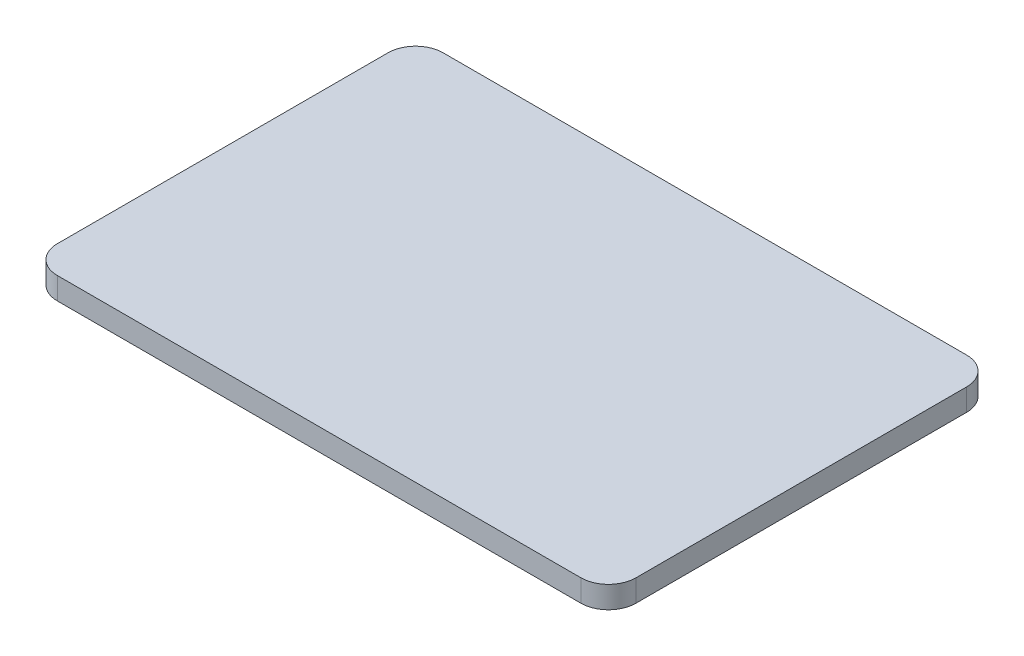
ISO-10303-21;
HEADER;
FILE_DESCRIPTION(('STEP AP214'),'2;1');
FILE_NAME('part.step','',(''),(''),'','','');
FILE_SCHEMA(('AUTOMOTIVE_DESIGN { 1 0 10303 214 1 1 1 1 }'));
ENDSEC;
DATA;
#1=APPLICATION_CONTEXT('core data for automotive mechanical design processes');
#2=APPLICATION_PROTOCOL_DEFINITION('international standard','automotive_design',2000,#1);
#3=PRODUCT_CONTEXT('',#1,'mechanical');
#4=PRODUCT('Part','Part','',(#3));
#5=PRODUCT_RELATED_PRODUCT_CATEGORY('part','',(#4));
#6=PRODUCT_DEFINITION_FORMATION('','',#4);
#7=PRODUCT_DEFINITION_CONTEXT('part definition',#1,'design');
#8=PRODUCT_DEFINITION('design','',#6,#7);
#9=PRODUCT_DEFINITION_SHAPE('','',#8);
#10=(LENGTH_UNIT() NAMED_UNIT(*) SI_UNIT(.MILLI.,.METRE.));
#11=(NAMED_UNIT(*) PLANE_ANGLE_UNIT() SI_UNIT($,.RADIAN.));
#12=(NAMED_UNIT(*) SI_UNIT($,.STERADIAN.) SOLID_ANGLE_UNIT());
#13=UNCERTAINTY_MEASURE_WITH_UNIT(LENGTH_MEASURE(1.E-05),#10,'distance_accuracy_value','');
#14=(GEOMETRIC_REPRESENTATION_CONTEXT(3) GLOBAL_UNCERTAINTY_ASSIGNED_CONTEXT((#13)) GLOBAL_UNIT_ASSIGNED_CONTEXT((#10,
#11,#12)) REPRESENTATION_CONTEXT('',''));
#15=CARTESIAN_POINT('',(0.,0.,0.));
#16=DIRECTION('',(0.,0.,1.));
#17=DIRECTION('',(1.,0.,0.));
#18=AXIS2_PLACEMENT_3D('',#15,#16,#17);
#19=CARTESIAN_POINT('',(0.,1.6,0.));
#20=DIRECTION('',(1.,0.,0.));
#21=DIRECTION('',(0.,0.,-1.));
#22=AXIS2_PLACEMENT_3D('',#19,#20,#21);
#23=PLANE('',#22);
#24=DIRECTION('',(0.,0.,1.));
#25=VECTOR('',#24,1.);
#26=CARTESIAN_POINT('',(0.,0.,0.));
#27=LINE('',#26,#25);
#28=CARTESIAN_POINT('',(0.,0.,-26.));
#29=VERTEX_POINT('',#28);
#30=CARTESIAN_POINT('',(0.,0.,-2.));
#31=VERTEX_POINT('',#30);
#32=EDGE_CURVE('E126',#29,#31,#27,.T.);
#33=ORIENTED_EDGE('',*,*,#32,.T.);
#34=DIRECTION('',(0.,-1.,0.));
#35=VECTOR('',#34,1.);
#36=CARTESIAN_POINT('',(0.,1.6,-2.));
#37=LINE('',#36,#35);
#38=CARTESIAN_POINT('',(0.,1.6,-2.));
#39=VERTEX_POINT('',#38);
#40=EDGE_CURVE('E104',#31,#39,#37,.F.);
#41=ORIENTED_EDGE('',*,*,#40,.T.);
#42=DIRECTION('',(0.,0.,1.));
#43=VECTOR('',#42,1.);
#44=CARTESIAN_POINT('',(0.,1.6,0.));
#45=LINE('',#44,#43);
#46=CARTESIAN_POINT('',(0.,1.6,-26.));
#47=VERTEX_POINT('',#46);
#48=EDGE_CURVE('E135',#47,#39,#45,.T.);
#49=ORIENTED_EDGE('',*,*,#48,.F.);
#50=DIRECTION('',(0.,-1.,0.));
#51=VECTOR('',#50,1.);
#52=CARTESIAN_POINT('',(0.,1.6,-26.));
#53=LINE('',#52,#51);
#54=EDGE_CURVE('E109',#47,#29,#53,.T.);
#55=ORIENTED_EDGE('',*,*,#54,.T.);
#56=EDGE_LOOP('',(#33,#41,#49,#55));
#57=FACE_BOUND('',#56,.T.);
#58=ADVANCED_FACE('F33',(#57),#23,.F.);
#59=CARTESIAN_POINT('',(0.,1.6,0.));
#60=DIRECTION('',(0.,0.,-1.));
#61=DIRECTION('',(-1.,0.,0.));
#62=AXIS2_PLACEMENT_3D('',#59,#60,#61);
#63=PLANE('',#62);
#64=DIRECTION('',(1.,0.,0.));
#65=VECTOR('',#64,1.);
#66=CARTESIAN_POINT('',(0.,1.6,0.));
#67=LINE('',#66,#65);
#68=CARTESIAN_POINT('',(2.,1.6,0.));
#69=VERTEX_POINT('',#68);
#70=CARTESIAN_POINT('',(40.,1.6,0.));
#71=VERTEX_POINT('',#70);
#72=EDGE_CURVE('E119',#69,#71,#67,.T.);
#73=ORIENTED_EDGE('',*,*,#72,.F.);
#74=DIRECTION('',(0.,-1.,0.));
#75=VECTOR('',#74,1.);
#76=CARTESIAN_POINT('',(2.,1.6,0.));
#77=LINE('',#76,#75);
#78=CARTESIAN_POINT('',(2.,0.,0.));
#79=VERTEX_POINT('',#78);
#80=EDGE_CURVE('E103',#69,#79,#77,.T.);
#81=ORIENTED_EDGE('',*,*,#80,.T.);
#82=DIRECTION('',(1.,0.,0.));
#83=VECTOR('',#82,1.);
#84=CARTESIAN_POINT('',(0.,0.,0.));
#85=LINE('',#84,#83);
#86=CARTESIAN_POINT('',(40.,0.,0.));
#87=VERTEX_POINT('',#86);
#88=EDGE_CURVE('E116',#79,#87,#85,.T.);
#89=ORIENTED_EDGE('',*,*,#88,.T.);
#90=DIRECTION('',(0.,-1.,0.));
#91=VECTOR('',#90,1.);
#92=CARTESIAN_POINT('',(40.,1.6,0.));
#93=LINE('',#92,#91);
#94=EDGE_CURVE('E121',#87,#71,#93,.F.);
#95=ORIENTED_EDGE('',*,*,#94,.T.);
#96=EDGE_LOOP('',(#73,#81,#89,#95));
#97=FACE_BOUND('',#96,.T.);
#98=ADVANCED_FACE('F115',(#97),#63,.F.);
#99=CARTESIAN_POINT('',(42.,1.6,0.));
#100=DIRECTION('',(-1.,0.,0.));
#101=DIRECTION('',(0.,0.,1.));
#102=AXIS2_PLACEMENT_3D('',#99,#100,#101);
#103=PLANE('',#102);
#104=DIRECTION('',(0.,0.,-1.));
#105=VECTOR('',#104,1.);
#106=CARTESIAN_POINT('',(42.,0.,0.));
#107=LINE('',#106,#105);
#108=CARTESIAN_POINT('',(42.,0.,-2.));
#109=VERTEX_POINT('',#108);
#110=CARTESIAN_POINT('',(42.,0.,-26.));
#111=VERTEX_POINT('',#110);
#112=EDGE_CURVE('E125',#109,#111,#107,.T.);
#113=ORIENTED_EDGE('',*,*,#112,.T.);
#114=DIRECTION('',(0.,-1.,0.));
#115=VECTOR('',#114,1.);
#116=CARTESIAN_POINT('',(42.,1.6,-26.));
#117=LINE('',#116,#115);
#118=CARTESIAN_POINT('',(42.,1.6,-26.));
#119=VERTEX_POINT('',#118);
#120=EDGE_CURVE('E11',#111,#119,#117,.F.);
#121=ORIENTED_EDGE('',*,*,#120,.T.);
#122=DIRECTION('',(0.,0.,-1.));
#123=VECTOR('',#122,1.);
#124=CARTESIAN_POINT('',(42.,1.6,0.));
#125=LINE('',#124,#123);
#126=CARTESIAN_POINT('',(42.,1.6,-2.));
#127=VERTEX_POINT('',#126);
#128=EDGE_CURVE('E161',#127,#119,#125,.T.);
#129=ORIENTED_EDGE('',*,*,#128,.F.);
#130=DIRECTION('',(0.,-1.,0.));
#131=VECTOR('',#130,1.);
#132=CARTESIAN_POINT('',(42.,1.6,-2.));
#133=LINE('',#132,#131);
#134=EDGE_CURVE('E41',#127,#109,#133,.T.);
#135=ORIENTED_EDGE('',*,*,#134,.T.);
#136=EDGE_LOOP('',(#113,#121,#129,#135));
#137=FACE_BOUND('',#136,.T.);
#138=ADVANCED_FACE('F159',(#137),#103,.F.);
#139=CARTESIAN_POINT('',(0.,1.6,-28.));
#140=DIRECTION('',(0.,0.,1.));
#141=DIRECTION('',(1.,0.,0.));
#142=AXIS2_PLACEMENT_3D('',#139,#140,#141);
#143=PLANE('',#142);
#144=DIRECTION('',(-1.,0.,0.));
#145=VECTOR('',#144,1.);
#146=CARTESIAN_POINT('',(0.,0.,-28.));
#147=LINE('',#146,#145);
#148=CARTESIAN_POINT('',(40.,0.,-28.));
#149=VERTEX_POINT('',#148);
#150=CARTESIAN_POINT('',(2.,0.,-28.));
#151=VERTEX_POINT('',#150);
#152=EDGE_CURVE('E129',#149,#151,#147,.T.);
#153=ORIENTED_EDGE('',*,*,#152,.T.);
#154=DIRECTION('',(0.,-1.,0.));
#155=VECTOR('',#154,1.);
#156=CARTESIAN_POINT('',(2.,1.6,-28.));
#157=LINE('',#156,#155);
#158=CARTESIAN_POINT('',(2.,1.6,-28.));
#159=VERTEX_POINT('',#158);
#160=EDGE_CURVE('E48',#151,#159,#157,.F.);
#161=ORIENTED_EDGE('',*,*,#160,.T.);
#162=DIRECTION('',(-1.,0.,0.));
#163=VECTOR('',#162,1.);
#164=CARTESIAN_POINT('',(0.,1.6,-28.));
#165=LINE('',#164,#163);
#166=CARTESIAN_POINT('',(40.,1.6,-28.));
#167=VERTEX_POINT('',#166);
#168=EDGE_CURVE('E136',#167,#159,#165,.T.);
#169=ORIENTED_EDGE('',*,*,#168,.F.);
#170=DIRECTION('',(0.,-1.,0.));
#171=VECTOR('',#170,1.);
#172=CARTESIAN_POINT('',(40.,1.6,-28.));
#173=LINE('',#172,#171);
#174=EDGE_CURVE('E152',#167,#149,#173,.T.);
#175=ORIENTED_EDGE('',*,*,#174,.T.);
#176=EDGE_LOOP('',(#153,#161,#169,#175));
#177=FACE_BOUND('',#176,.T.);
#178=ADVANCED_FACE('F168',(#177),#143,.F.);
#179=CARTESIAN_POINT('',(0.,1.6,0.));
#180=DIRECTION('',(0.,-1.,0.));
#181=DIRECTION('',(0.,0.,-1.));
#182=AXIS2_PLACEMENT_3D('',#179,#180,#181);
#183=PLANE('',#182);
#184=ORIENTED_EDGE('',*,*,#48,.T.);
#185=CARTESIAN_POINT('',(2.,1.6,-2.));
#186=DIRECTION('',(0.,-1.,0.));
#187=DIRECTION('',(0.,0.,-1.));
#188=AXIS2_PLACEMENT_3D('',#185,#186,#187);
#189=CIRCLE('',#188,2.);
#190=EDGE_CURVE('E150',#39,#69,#189,.F.);
#191=ORIENTED_EDGE('',*,*,#190,.T.);
#192=ORIENTED_EDGE('',*,*,#72,.T.);
#193=CARTESIAN_POINT('',(40.,1.6,-2.));
#194=DIRECTION('',(0.,-1.,0.));
#195=DIRECTION('',(0.,0.,-1.));
#196=AXIS2_PLACEMENT_3D('',#193,#194,#195);
#197=CIRCLE('',#196,2.);
#198=EDGE_CURVE('E145',#71,#127,#197,.F.);
#199=ORIENTED_EDGE('',*,*,#198,.T.);
#200=ORIENTED_EDGE('',*,*,#128,.T.);
#201=CARTESIAN_POINT('',(40.,1.6,-26.));
#202=DIRECTION('',(0.,-1.,0.));
#203=DIRECTION('',(0.,0.,-1.));
#204=AXIS2_PLACEMENT_3D('',#201,#202,#203);
#205=CIRCLE('',#204,2.);
#206=EDGE_CURVE('E55',#119,#167,#205,.F.);
#207=ORIENTED_EDGE('',*,*,#206,.T.);
#208=ORIENTED_EDGE('',*,*,#168,.T.);
#209=CARTESIAN_POINT('',(2.,1.6,-26.));
#210=DIRECTION('',(0.,-1.,0.));
#211=DIRECTION('',(0.,0.,-1.));
#212=AXIS2_PLACEMENT_3D('',#209,#210,#211);
#213=CIRCLE('',#212,2.);
#214=EDGE_CURVE('E148',#159,#47,#213,.F.);
#215=ORIENTED_EDGE('',*,*,#214,.T.);
#216=EDGE_LOOP('',(#184,#191,#192,#199,#200,#207,#208,#215));
#217=FACE_BOUND('',#216,.T.);
#218=ADVANCED_FACE('F175',(#217),#183,.F.);
#219=CARTESIAN_POINT('',(0.,0.,0.));
#220=DIRECTION('',(0.,-1.,0.));
#221=DIRECTION('',(0.,0.,-1.));
#222=AXIS2_PLACEMENT_3D('',#219,#220,#221);
#223=PLANE('',#222);
#224=ORIENTED_EDGE('',*,*,#88,.F.);
#225=CARTESIAN_POINT('',(2.,0.,-2.));
#226=DIRECTION('',(0.,-1.,0.));
#227=DIRECTION('',(0.,0.,-1.));
#228=AXIS2_PLACEMENT_3D('',#225,#226,#227);
#229=CIRCLE('',#228,2.);
#230=EDGE_CURVE('E99',#79,#31,#229,.T.);
#231=ORIENTED_EDGE('',*,*,#230,.T.);
#232=ORIENTED_EDGE('',*,*,#32,.F.);
#233=CARTESIAN_POINT('',(2.,0.,-26.));
#234=DIRECTION('',(0.,-1.,0.));
#235=DIRECTION('',(0.,0.,-1.));
#236=AXIS2_PLACEMENT_3D('',#233,#234,#235);
#237=CIRCLE('',#236,2.);
#238=EDGE_CURVE('E110',#29,#151,#237,.T.);
#239=ORIENTED_EDGE('',*,*,#238,.T.);
#240=ORIENTED_EDGE('',*,*,#152,.F.);
#241=CARTESIAN_POINT('',(40.,0.,-26.));
#242=DIRECTION('',(0.,-1.,0.));
#243=DIRECTION('',(0.,0.,-1.));
#244=AXIS2_PLACEMENT_3D('',#241,#242,#243);
#245=CIRCLE('',#244,2.);
#246=EDGE_CURVE('E139',#149,#111,#245,.T.);
#247=ORIENTED_EDGE('',*,*,#246,.T.);
#248=ORIENTED_EDGE('',*,*,#112,.F.);
#249=CARTESIAN_POINT('',(40.,0.,-2.));
#250=DIRECTION('',(0.,-1.,0.));
#251=DIRECTION('',(0.,0.,-1.));
#252=AXIS2_PLACEMENT_3D('',#249,#250,#251);
#253=CIRCLE('',#252,2.);
#254=EDGE_CURVE('E120',#109,#87,#253,.T.);
#255=ORIENTED_EDGE('',*,*,#254,.T.);
#256=EDGE_LOOP('',(#224,#231,#232,#239,#240,#247,#248,#255));
#257=FACE_BOUND('',#256,.T.);
#258=ADVANCED_FACE('F123',(#257),#223,.T.);
#259=CARTESIAN_POINT('',(2.,1.6,-2.));
#260=DIRECTION('',(0.,-1.,0.));
#261=DIRECTION('',(0.,0.,-1.));
#262=AXIS2_PLACEMENT_3D('',#259,#260,#261);
#263=CYLINDRICAL_SURFACE('',#262,2.);
#264=ORIENTED_EDGE('',*,*,#190,.F.);
#265=ORIENTED_EDGE('',*,*,#40,.F.);
#266=ORIENTED_EDGE('',*,*,#230,.F.);
#267=ORIENTED_EDGE('',*,*,#80,.F.);
#268=EDGE_LOOP('',(#264,#265,#266,#267));
#269=FACE_BOUND('',#268,.T.);
#270=ADVANCED_FACE('F102',(#269),#263,.T.);
#271=CARTESIAN_POINT('',(2.,1.6,-26.));
#272=DIRECTION('',(0.,-1.,0.));
#273=DIRECTION('',(0.,0.,-1.));
#274=AXIS2_PLACEMENT_3D('',#271,#272,#273);
#275=CYLINDRICAL_SURFACE('',#274,2.);
#276=ORIENTED_EDGE('',*,*,#214,.F.);
#277=ORIENTED_EDGE('',*,*,#160,.F.);
#278=ORIENTED_EDGE('',*,*,#238,.F.);
#279=ORIENTED_EDGE('',*,*,#54,.F.);
#280=EDGE_LOOP('',(#276,#277,#278,#279));
#281=FACE_BOUND('',#280,.T.);
#282=ADVANCED_FACE('F179',(#281),#275,.T.);
#283=CARTESIAN_POINT('',(40.,1.6,-26.));
#284=DIRECTION('',(0.,-1.,0.));
#285=DIRECTION('',(0.,0.,-1.));
#286=AXIS2_PLACEMENT_3D('',#283,#284,#285);
#287=CYLINDRICAL_SURFACE('',#286,2.);
#288=ORIENTED_EDGE('',*,*,#206,.F.);
#289=ORIENTED_EDGE('',*,*,#120,.F.);
#290=ORIENTED_EDGE('',*,*,#246,.F.);
#291=ORIENTED_EDGE('',*,*,#174,.F.);
#292=EDGE_LOOP('',(#288,#289,#290,#291));
#293=FACE_BOUND('',#292,.T.);
#294=ADVANCED_FACE('F167',(#293),#287,.T.);
#295=CARTESIAN_POINT('',(40.,1.6,-2.));
#296=DIRECTION('',(0.,-1.,0.));
#297=DIRECTION('',(0.,0.,-1.));
#298=AXIS2_PLACEMENT_3D('',#295,#296,#297);
#299=CYLINDRICAL_SURFACE('',#298,2.);
#300=ORIENTED_EDGE('',*,*,#198,.F.);
#301=ORIENTED_EDGE('',*,*,#94,.F.);
#302=ORIENTED_EDGE('',*,*,#254,.F.);
#303=ORIENTED_EDGE('',*,*,#134,.F.);
#304=EDGE_LOOP('',(#300,#301,#302,#303));
#305=FACE_BOUND('',#304,.T.);
#306=ADVANCED_FACE('F35',(#305),#299,.T.);
#307=CLOSED_SHELL('',(#58,#98,#138,#178,#218,#258,#270,#282,#294,#306));
#308=MANIFOLD_SOLID_BREP('B2',#307);
#309=ADVANCED_BREP_SHAPE_REPRESENTATION('',(#18,#308),#14);
#310=SHAPE_DEFINITION_REPRESENTATION(#9,#309);
ENDSEC;
END-ISO-10303-21;
